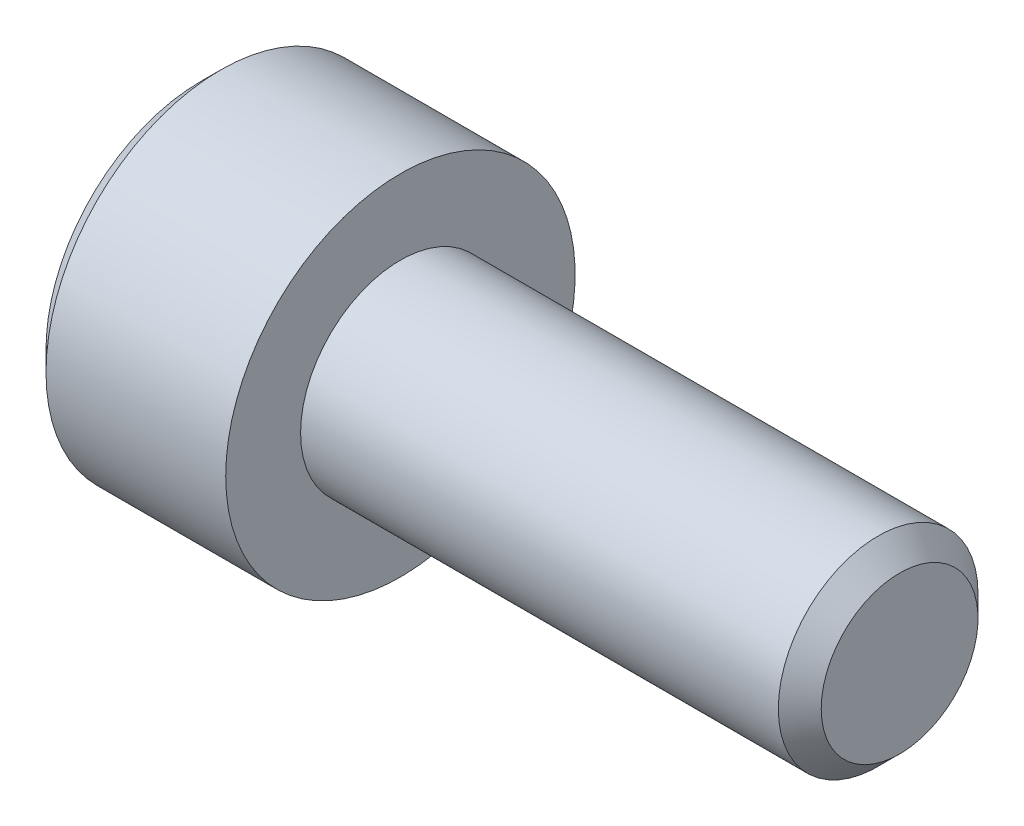
ISO-10303-21;
HEADER;
FILE_DESCRIPTION(('STEP AP214'),'2;1');
FILE_NAME('part.step','',(''),(''),'','','');
FILE_SCHEMA(('AUTOMOTIVE_DESIGN { 1 0 10303 214 1 1 1 1 }'));
ENDSEC;
DATA;
#1=APPLICATION_CONTEXT('core data for automotive mechanical design processes');
#2=APPLICATION_PROTOCOL_DEFINITION('international standard','automotive_design',2000,#1);
#3=PRODUCT_CONTEXT('',#1,'mechanical');
#4=PRODUCT('Part','Part','',(#3));
#5=PRODUCT_RELATED_PRODUCT_CATEGORY('part','',(#4));
#6=PRODUCT_DEFINITION_FORMATION('','',#4);
#7=PRODUCT_DEFINITION_CONTEXT('part definition',#1,'design');
#8=PRODUCT_DEFINITION('design','',#6,#7);
#9=PRODUCT_DEFINITION_SHAPE('','',#8);
#10=(LENGTH_UNIT() NAMED_UNIT(*) SI_UNIT(.MILLI.,.METRE.));
#11=(NAMED_UNIT(*) PLANE_ANGLE_UNIT() SI_UNIT($,.RADIAN.));
#12=(NAMED_UNIT(*) SI_UNIT($,.STERADIAN.) SOLID_ANGLE_UNIT());
#13=UNCERTAINTY_MEASURE_WITH_UNIT(LENGTH_MEASURE(1.E-05),#10,'distance_accuracy_value','');
#14=(GEOMETRIC_REPRESENTATION_CONTEXT(3) GLOBAL_UNCERTAINTY_ASSIGNED_CONTEXT((#13)) GLOBAL_UNIT_ASSIGNED_CONTEXT((#10,
#11,#12)) REPRESENTATION_CONTEXT('',''));
#15=CARTESIAN_POINT('',(0.,0.,0.));
#16=DIRECTION('',(0.,0.,1.));
#17=DIRECTION('',(1.,0.,0.));
#18=AXIS2_PLACEMENT_3D('',#15,#16,#17);
#19=CARTESIAN_POINT('',(-2.,0.,0.));
#20=DIRECTION('',(1.,0.,0.));
#21=DIRECTION('',(0.,0.,-1.));
#22=AXIS2_PLACEMENT_3D('',#19,#20,#21);
#23=PLANE('',#22);
#24=DIRECTION('',(0.,1.,0.));
#25=VECTOR('',#24,1.);
#26=CARTESIAN_POINT('',(-2.,0.866025403784439,1.5));
#27=LINE('',#26,#25);
#28=CARTESIAN_POINT('',(-2.,0.86602540378444,1.5));
#29=VERTEX_POINT('',#28);
#30=CARTESIAN_POINT('',(-1.99999999999056,0.,1.49999999998226));
#31=VERTEX_POINT('',#30);
#32=EDGE_CURVE('E91',#29,#31,#27,.F.);
#33=ORIENTED_EDGE('',*,*,#32,.F.);
#34=DIRECTION('',(0.,0.5,-0.866025403784439));
#35=VECTOR('',#34,1.);
#36=CARTESIAN_POINT('',(-2.,1.73205080756888,0.));
#37=LINE('',#36,#35);
#38=CARTESIAN_POINT('',(-1.99999999999056,1.2990381056613,0.749999999991132));
#39=VERTEX_POINT('',#38);
#40=EDGE_CURVE('E87',#39,#29,#37,.F.);
#41=ORIENTED_EDGE('',*,*,#40,.F.);
#42=CARTESIAN_POINT('',(-1.99999999998113,0.,0.));
#43=DIRECTION('',(-1.,0.,0.));
#44=DIRECTION('',(0.,0.,1.));
#45=AXIS2_PLACEMENT_3D('',#42,#43,#44);
#46=CIRCLE('',#45,1.49999999996453);
#47=EDGE_CURVE('E19',#39,#31,#46,.F.);
#48=ORIENTED_EDGE('',*,*,#47,.T.);
#49=EDGE_LOOP('',(#33,#41,#48));
#50=FACE_BOUND('',#49,.T.);
#51=ADVANCED_FACE('F16',(#50),#23,.F.);
#52=CARTESIAN_POINT('',(-2.,0.,0.));
#53=DIRECTION('',(1.,0.,0.));
#54=DIRECTION('',(0.,0.,-1.));
#55=AXIS2_PLACEMENT_3D('',#52,#53,#54);
#56=PLANE('',#55);
#57=CARTESIAN_POINT('',(-1.99999999998113,0.,0.));
#58=DIRECTION('',(-1.,0.,0.));
#59=DIRECTION('',(0.,0.,1.));
#60=AXIS2_PLACEMENT_3D('',#57,#58,#59);
#61=CIRCLE('',#60,1.49999999996453);
#62=CARTESIAN_POINT('',(-1.99999999999056,1.2990381056613,-0.749999999991131));
#63=VERTEX_POINT('',#62);
#64=EDGE_CURVE('E103',#63,#39,#61,.F.);
#65=ORIENTED_EDGE('',*,*,#64,.T.);
#66=DIRECTION('',(0.,0.5,-0.866025403784439));
#67=VECTOR('',#66,1.);
#68=CARTESIAN_POINT('',(-2.,1.73205080756888,0.));
#69=LINE('',#68,#67);
#70=CARTESIAN_POINT('',(-2.,1.73205080756888,0.));
#71=VERTEX_POINT('',#70);
#72=EDGE_CURVE('E97',#71,#39,#69,.F.);
#73=ORIENTED_EDGE('',*,*,#72,.F.);
#74=DIRECTION('',(0.,-0.5,-0.866025403784439));
#75=VECTOR('',#74,1.);
#76=CARTESIAN_POINT('',(-2.,0.866025403784439,-1.5));
#77=LINE('',#76,#75);
#78=EDGE_CURVE('E113',#63,#71,#77,.F.);
#79=ORIENTED_EDGE('',*,*,#78,.F.);
#80=EDGE_LOOP('',(#65,#73,#79));
#81=FACE_BOUND('',#80,.T.);
#82=ADVANCED_FACE('F110',(#81),#56,.F.);
#83=CARTESIAN_POINT('',(-2.,1.73205080756888,0.));
#84=DIRECTION('',(0.,-0.866025403784439,-0.5));
#85=DIRECTION('',(0.,0.5,-0.866025403784439));
#86=AXIS2_PLACEMENT_3D('',#83,#84,#85);
#87=PLANE('',#86);
#88=ORIENTED_EDGE('',*,*,#40,.T.);
#89=DIRECTION('',(-1.,0.,0.));
#90=VECTOR('',#89,1.);
#91=CARTESIAN_POINT('',(-2.,0.866025403784439,1.5));
#92=LINE('',#91,#90);
#93=CARTESIAN_POINT('',(-4.,0.86602540378444,1.5));
#94=VERTEX_POINT('',#93);
#95=EDGE_CURVE('E131',#94,#29,#92,.F.);
#96=ORIENTED_EDGE('',*,*,#95,.F.);
#97=DIRECTION('',(0.,0.5,-0.866025403784439));
#98=VECTOR('',#97,1.);
#99=CARTESIAN_POINT('',(-4.,1.73205080756888,0.));
#100=LINE('',#99,#98);
#101=CARTESIAN_POINT('',(-4.,1.73205080756888,0.));
#102=VERTEX_POINT('',#101);
#103=EDGE_CURVE('E121',#94,#102,#100,.T.);
#104=ORIENTED_EDGE('',*,*,#103,.T.);
#105=DIRECTION('',(1.,0.,0.));
#106=VECTOR('',#105,1.);
#107=CARTESIAN_POINT('',(-2.,1.73205080756888,0.));
#108=LINE('',#107,#106);
#109=EDGE_CURVE('E120',#71,#102,#108,.F.);
#110=ORIENTED_EDGE('',*,*,#109,.F.);
#111=ORIENTED_EDGE('',*,*,#72,.T.);
#112=EDGE_LOOP('',(#88,#96,#104,#110,#111));
#113=FACE_BOUND('',#112,.T.);
#114=ADVANCED_FACE('F117',(#113),#87,.T.);
#115=CARTESIAN_POINT('',(-2.,0.866025403784439,1.5));
#116=DIRECTION('',(0.,0.,-1.));
#117=DIRECTION('',(-1.,0.,0.));
#118=AXIS2_PLACEMENT_3D('',#115,#116,#117);
#119=PLANE('',#118);
#120=DIRECTION('',(0.,1.,0.));
#121=VECTOR('',#120,1.);
#122=CARTESIAN_POINT('',(-2.,0.,1.5));
#123=LINE('',#122,#121);
#124=CARTESIAN_POINT('',(-2.,-0.866025403784439,1.5));
#125=VERTEX_POINT('',#124);
#126=EDGE_CURVE('E107',#31,#125,#123,.F.);
#127=ORIENTED_EDGE('',*,*,#126,.T.);
#128=DIRECTION('',(1.,0.,0.));
#129=VECTOR('',#128,1.);
#130=CARTESIAN_POINT('',(-2.,-0.866025403784439,1.5));
#131=LINE('',#130,#129);
#132=CARTESIAN_POINT('',(-4.,-0.866025403784439,1.5));
#133=VERTEX_POINT('',#132);
#134=EDGE_CURVE('E176',#133,#125,#131,.T.);
#135=ORIENTED_EDGE('',*,*,#134,.F.);
#136=DIRECTION('',(0.,1.,0.));
#137=VECTOR('',#136,1.);
#138=CARTESIAN_POINT('',(-4.,0.866025403784439,1.5));
#139=LINE('',#138,#137);
#140=EDGE_CURVE('E96',#133,#94,#139,.T.);
#141=ORIENTED_EDGE('',*,*,#140,.T.);
#142=ORIENTED_EDGE('',*,*,#95,.T.);
#143=ORIENTED_EDGE('',*,*,#32,.T.);
#144=EDGE_LOOP('',(#127,#135,#141,#142,#143));
#145=FACE_BOUND('',#144,.T.);
#146=ADVANCED_FACE('F263',(#145),#119,.T.);
#147=CARTESIAN_POINT('',(-2.,0.,0.));
#148=DIRECTION('',(1.,0.,0.));
#149=DIRECTION('',(0.,0.,-1.));
#150=AXIS2_PLACEMENT_3D('',#147,#148,#149);
#151=PLANE('',#150);
#152=DIRECTION('',(0.,0.5,0.866025403784439));
#153=VECTOR('',#152,1.);
#154=CARTESIAN_POINT('',(-2.,-0.866025403784439,1.5));
#155=LINE('',#154,#153);
#156=CARTESIAN_POINT('',(-1.99999999999056,-1.2990381056613,0.749999999991131));
#157=VERTEX_POINT('',#156);
#158=EDGE_CURVE('E167',#125,#157,#155,.F.);
#159=ORIENTED_EDGE('',*,*,#158,.F.);
#160=ORIENTED_EDGE('',*,*,#126,.F.);
#161=CARTESIAN_POINT('',(-1.99999999998113,0.,0.));
#162=DIRECTION('',(-1.,0.,0.));
#163=DIRECTION('',(0.,0.,1.));
#164=AXIS2_PLACEMENT_3D('',#161,#162,#163);
#165=CIRCLE('',#164,1.49999999996453);
#166=EDGE_CURVE('E106',#31,#157,#165,.F.);
#167=ORIENTED_EDGE('',*,*,#166,.T.);
#168=EDGE_LOOP('',(#159,#160,#167));
#169=FACE_BOUND('',#168,.T.);
#170=ADVANCED_FACE('F166',(#169),#151,.F.);
#171=CARTESIAN_POINT('',(-1.99999999998113,0.,0.));
#172=DIRECTION('',(-1.,0.,0.));
#173=DIRECTION('',(0.,0.,1.));
#174=AXIS2_PLACEMENT_3D('',#171,#172,#173);
#175=CONICAL_SURFACE('',#174,1.49999999996453,1.30899693899977);
#176=CARTESIAN_POINT('',(-1.59807621136565,0.,5.6843418860808E-11));
#177=VERTEX_POINT('',#176);
#178=VERTEX_LOOP('',#177);
#179=FACE_BOUND('',#178,.T.);
#180=CARTESIAN_POINT('',(-1.99999999998113,0.,0.));
#181=DIRECTION('',(-1.,0.,0.));
#182=DIRECTION('',(0.,0.,1.));
#183=AXIS2_PLACEMENT_3D('',#180,#181,#182);
#184=CIRCLE('',#183,1.49999999996453);
#185=CARTESIAN_POINT('',(-1.99999999999056,0.,-1.49999999998226));
#186=VERTEX_POINT('',#185);
#187=EDGE_CURVE('E115',#63,#186,#184,.T.);
#188=ORIENTED_EDGE('',*,*,#187,.T.);
#189=CARTESIAN_POINT('',(-1.99999999998113,0.,0.));
#190=DIRECTION('',(-1.,0.,0.));
#191=DIRECTION('',(0.,0.,1.));
#192=AXIS2_PLACEMENT_3D('',#189,#190,#191);
#193=CIRCLE('',#192,1.49999999996453);
#194=CARTESIAN_POINT('',(-1.99999999999056,-1.2990381056613,-0.749999999991133));
#195=VERTEX_POINT('',#194);
#196=EDGE_CURVE('E158',#186,#195,#193,.T.);
#197=ORIENTED_EDGE('',*,*,#196,.T.);
#198=CARTESIAN_POINT('',(-1.99999999998113,0.,0.));
#199=DIRECTION('',(-1.,0.,0.));
#200=DIRECTION('',(0.,0.,1.));
#201=AXIS2_PLACEMENT_3D('',#198,#199,#200);
#202=CIRCLE('',#201,1.49999999996453);
#203=EDGE_CURVE('E160',#195,#157,#202,.T.);
#204=ORIENTED_EDGE('',*,*,#203,.T.);
#205=ORIENTED_EDGE('',*,*,#166,.F.);
#206=ORIENTED_EDGE('',*,*,#47,.F.);
#207=ORIENTED_EDGE('',*,*,#64,.F.);
#208=EDGE_LOOP('',(#188,#197,#204,#205,#206,#207));
#209=FACE_BOUND('',#208,.T.);
#210=ADVANCED_FACE('F102',(#179,#209),#175,.F.);
#211=CARTESIAN_POINT('',(-2.,0.,0.));
#212=DIRECTION('',(1.,0.,0.));
#213=DIRECTION('',(0.,0.,-1.));
#214=AXIS2_PLACEMENT_3D('',#211,#212,#213);
#215=PLANE('',#214);
#216=DIRECTION('',(0.,-0.5,-0.866025403784439));
#217=VECTOR('',#216,1.);
#218=CARTESIAN_POINT('',(-2.,0.866025403784439,-1.5));
#219=LINE('',#218,#217);
#220=CARTESIAN_POINT('',(-2.,0.866025403784438,-1.5));
#221=VERTEX_POINT('',#220);
#222=EDGE_CURVE('E144',#221,#63,#219,.F.);
#223=ORIENTED_EDGE('',*,*,#222,.F.);
#224=DIRECTION('',(0.,1.,0.));
#225=VECTOR('',#224,1.);
#226=CARTESIAN_POINT('',(-2.,-0.866025403784439,-1.5));
#227=LINE('',#226,#225);
#228=EDGE_CURVE('E207',#186,#221,#227,.T.);
#229=ORIENTED_EDGE('',*,*,#228,.F.);
#230=ORIENTED_EDGE('',*,*,#187,.F.);
#231=EDGE_LOOP('',(#223,#229,#230));
#232=FACE_BOUND('',#231,.T.);
#233=ADVANCED_FACE('F238',(#232),#215,.F.);
#234=CARTESIAN_POINT('',(-2.,0.866025403784439,-1.5));
#235=DIRECTION('',(0.,-0.866025403784439,0.5));
#236=DIRECTION('',(0.,-0.5,-0.866025403784439));
#237=AXIS2_PLACEMENT_3D('',#234,#235,#236);
#238=PLANE('',#237);
#239=ORIENTED_EDGE('',*,*,#78,.T.);
#240=ORIENTED_EDGE('',*,*,#109,.T.);
#241=DIRECTION('',(0.,-0.5,-0.866025403784439));
#242=VECTOR('',#241,1.);
#243=CARTESIAN_POINT('',(-4.,0.866025403784439,-1.5));
#244=LINE('',#243,#242);
#245=CARTESIAN_POINT('',(-4.,0.866025403784438,-1.5));
#246=VERTEX_POINT('',#245);
#247=EDGE_CURVE('E141',#102,#246,#244,.T.);
#248=ORIENTED_EDGE('',*,*,#247,.T.);
#249=DIRECTION('',(1.,0.,0.));
#250=VECTOR('',#249,1.);
#251=CARTESIAN_POINT('',(-2.,0.866025403784438,-1.5));
#252=LINE('',#251,#250);
#253=EDGE_CURVE('E195',#221,#246,#252,.F.);
#254=ORIENTED_EDGE('',*,*,#253,.F.);
#255=ORIENTED_EDGE('',*,*,#222,.T.);
#256=EDGE_LOOP('',(#239,#240,#248,#254,#255));
#257=FACE_BOUND('',#256,.T.);
#258=ADVANCED_FACE('F234',(#257),#238,.T.);
#259=CARTESIAN_POINT('',(-2.,-0.866025403784439,1.5));
#260=DIRECTION('',(0.,0.866025403784439,-0.5));
#261=DIRECTION('',(0.,0.5,0.866025403784439));
#262=AXIS2_PLACEMENT_3D('',#259,#260,#261);
#263=PLANE('',#262);
#264=DIRECTION('',(0.,-0.500000000000001,-0.866025403784438));
#265=VECTOR('',#264,1.);
#266=CARTESIAN_POINT('',(-2.,-1.29903810567666,0.75));
#267=LINE('',#266,#265);
#268=CARTESIAN_POINT('',(-2.,-1.73205080756888,0.));
#269=VERTEX_POINT('',#268);
#270=EDGE_CURVE('E162',#157,#269,#267,.T.);
#271=ORIENTED_EDGE('',*,*,#270,.T.);
#272=DIRECTION('',(1.,0.,0.));
#273=VECTOR('',#272,1.);
#274=CARTESIAN_POINT('',(-2.,-1.73205080756888,0.));
#275=LINE('',#274,#273);
#276=CARTESIAN_POINT('',(-4.,-1.73205080756888,0.));
#277=VERTEX_POINT('',#276);
#278=EDGE_CURVE('E193',#277,#269,#275,.T.);
#279=ORIENTED_EDGE('',*,*,#278,.F.);
#280=DIRECTION('',(0.,0.5,0.866025403784439));
#281=VECTOR('',#280,1.);
#282=CARTESIAN_POINT('',(-4.,-0.866025403784439,1.5));
#283=LINE('',#282,#281);
#284=EDGE_CURVE('E198',#277,#133,#283,.T.);
#285=ORIENTED_EDGE('',*,*,#284,.T.);
#286=ORIENTED_EDGE('',*,*,#134,.T.);
#287=ORIENTED_EDGE('',*,*,#158,.T.);
#288=EDGE_LOOP('',(#271,#279,#285,#286,#287));
#289=FACE_BOUND('',#288,.T.);
#290=ADVANCED_FACE('F170',(#289),#263,.T.);
#291=CARTESIAN_POINT('',(-2.,0.,0.));
#292=DIRECTION('',(1.,0.,0.));
#293=DIRECTION('',(0.,0.,-1.));
#294=AXIS2_PLACEMENT_3D('',#291,#292,#293);
#295=PLANE('',#294);
#296=DIRECTION('',(0.,-0.5,0.866025403784439));
#297=VECTOR('',#296,1.);
#298=CARTESIAN_POINT('',(-2.,-1.73205080756888,0.));
#299=LINE('',#298,#297);
#300=EDGE_CURVE('E184',#269,#195,#299,.F.);
#301=ORIENTED_EDGE('',*,*,#300,.F.);
#302=ORIENTED_EDGE('',*,*,#270,.F.);
#303=ORIENTED_EDGE('',*,*,#203,.F.);
#304=EDGE_LOOP('',(#301,#302,#303));
#305=FACE_BOUND('',#304,.T.);
#306=ADVANCED_FACE('F182',(#305),#295,.F.);
#307=CARTESIAN_POINT('',(-2.,0.,0.));
#308=DIRECTION('',(1.,0.,0.));
#309=DIRECTION('',(0.,0.,-1.));
#310=AXIS2_PLACEMENT_3D('',#307,#308,#309);
#311=PLANE('',#310);
#312=DIRECTION('',(0.,1.,0.));
#313=VECTOR('',#312,1.);
#314=CARTESIAN_POINT('',(-2.,-0.866025403784439,-1.5));
#315=LINE('',#314,#313);
#316=CARTESIAN_POINT('',(-2.,-0.866025403784441,-1.5));
#317=VERTEX_POINT('',#316);
#318=EDGE_CURVE('E210',#317,#186,#315,.T.);
#319=ORIENTED_EDGE('',*,*,#318,.F.);
#320=DIRECTION('',(0.,-0.5,0.866025403784439));
#321=VECTOR('',#320,1.);
#322=CARTESIAN_POINT('',(-2.,-1.73205080756888,0.));
#323=LINE('',#322,#321);
#324=EDGE_CURVE('E243',#195,#317,#323,.F.);
#325=ORIENTED_EDGE('',*,*,#324,.F.);
#326=ORIENTED_EDGE('',*,*,#196,.F.);
#327=EDGE_LOOP('',(#319,#325,#326));
#328=FACE_BOUND('',#327,.T.);
#329=ADVANCED_FACE('F241',(#328),#311,.F.);
#330=CARTESIAN_POINT('',(-2.,-0.866025403784439,-1.5));
#331=DIRECTION('',(0.,0.,1.));
#332=DIRECTION('',(1.,0.,0.));
#333=AXIS2_PLACEMENT_3D('',#330,#331,#332);
#334=PLANE('',#333);
#335=ORIENTED_EDGE('',*,*,#228,.T.);
#336=ORIENTED_EDGE('',*,*,#253,.T.);
#337=DIRECTION('',(0.,1.,0.));
#338=VECTOR('',#337,1.);
#339=CARTESIAN_POINT('',(-4.,-0.866025403784439,-1.5));
#340=LINE('',#339,#338);
#341=CARTESIAN_POINT('',(-4.,-0.86602540378444,-1.5));
#342=VERTEX_POINT('',#341);
#343=EDGE_CURVE('E34',#246,#342,#340,.F.);
#344=ORIENTED_EDGE('',*,*,#343,.T.);
#345=DIRECTION('',(1.,0.,0.));
#346=VECTOR('',#345,1.);
#347=CARTESIAN_POINT('',(-2.,-0.866025403784441,-1.5));
#348=LINE('',#347,#346);
#349=EDGE_CURVE('E204',#317,#342,#348,.F.);
#350=ORIENTED_EDGE('',*,*,#349,.F.);
#351=ORIENTED_EDGE('',*,*,#318,.T.);
#352=EDGE_LOOP('',(#335,#336,#344,#350,#351));
#353=FACE_BOUND('',#352,.T.);
#354=ADVANCED_FACE('F257',(#353),#334,.T.);
#355=CARTESIAN_POINT('',(-2.,-1.73205080756888,0.));
#356=DIRECTION('',(0.,0.866025403784439,0.5));
#357=DIRECTION('',(0.,-0.5,0.866025403784439));
#358=AXIS2_PLACEMENT_3D('',#355,#356,#357);
#359=PLANE('',#358);
#360=ORIENTED_EDGE('',*,*,#324,.T.);
#361=ORIENTED_EDGE('',*,*,#349,.T.);
#362=DIRECTION('',(0.,-0.500000000000001,0.866025403784438));
#363=VECTOR('',#362,1.);
#364=CARTESIAN_POINT('',(-4.,-0.866025403784439,-1.5));
#365=LINE('',#364,#363);
#366=EDGE_CURVE('E157',#342,#277,#365,.T.);
#367=ORIENTED_EDGE('',*,*,#366,.T.);
#368=ORIENTED_EDGE('',*,*,#278,.T.);
#369=ORIENTED_EDGE('',*,*,#300,.T.);
#370=EDGE_LOOP('',(#360,#361,#367,#368,#369));
#371=FACE_BOUND('',#370,.T.);
#372=ADVANCED_FACE('F246',(#371),#359,.T.);
#373=CARTESIAN_POINT('',(-4.,0.,0.));
#374=DIRECTION('',(1.,0.,0.));
#375=DIRECTION('',(0.,0.,-1.));
#376=AXIS2_PLACEMENT_3D('',#373,#374,#375);
#377=PLANE('',#376);
#378=ORIENTED_EDGE('',*,*,#343,.F.);
#379=ORIENTED_EDGE('',*,*,#247,.F.);
#380=ORIENTED_EDGE('',*,*,#103,.F.);
#381=ORIENTED_EDGE('',*,*,#140,.F.);
#382=ORIENTED_EDGE('',*,*,#284,.F.);
#383=ORIENTED_EDGE('',*,*,#366,.F.);
#384=EDGE_LOOP('',(#378,#379,#380,#381,#382,#383));
#385=FACE_BOUND('',#384,.T.);
#386=CARTESIAN_POINT('',(-4.0000000000191,0.,0.));
#387=DIRECTION('',(1.,0.,0.));
#388=DIRECTION('',(0.,1.,0.));
#389=AXIS2_PLACEMENT_3D('',#386,#387,#388);
#390=CIRCLE('',#389,3.0999999999608);
#391=CARTESIAN_POINT('',(-4.0000000000191,3.0999999999608,0.));
#392=VERTEX_POINT('',#391);
#393=EDGE_CURVE('E154',#392,#392,#390,.T.);
#394=ORIENTED_EDGE('',*,*,#393,.F.);
#395=EDGE_LOOP('',(#394));
#396=FACE_BOUND('',#395,.T.);
#397=ADVANCED_FACE('F260',(#385,#396),#377,.F.);
#398=CARTESIAN_POINT('',(-3.60000000006266,0.,0.));
#399=DIRECTION('',(1.,0.,0.));
#400=DIRECTION('',(0.,1.,0.));
#401=AXIS2_PLACEMENT_3D('',#398,#399,#400);
#402=CONICAL_SURFACE('',#401,3.49999999997408,0.785398163468503);
#403=ORIENTED_EDGE('',*,*,#393,.T.);
#404=EDGE_LOOP('',(#403));
#405=FACE_BOUND('',#404,.T.);
#406=CARTESIAN_POINT('',(-3.6,0.,0.));
#407=DIRECTION('',(-1.,0.,0.));
#408=DIRECTION('',(0.,0.,1.));
#409=AXIS2_PLACEMENT_3D('',#406,#407,#408);
#410=CIRCLE('',#409,3.5);
#411=CARTESIAN_POINT('',(-3.6,0.,3.5));
#412=VERTEX_POINT('',#411);
#413=EDGE_CURVE('E153',#412,#412,#410,.F.);
#414=ORIENTED_EDGE('',*,*,#413,.F.);
#415=EDGE_LOOP('',(#414));
#416=FACE_BOUND('',#415,.T.);
#417=ADVANCED_FACE('F296',(#405,#416),#402,.T.);
#418=CARTESIAN_POINT('',(10.,1.5705,0.));
#419=DIRECTION('',(-1.,0.,0.));
#420=DIRECTION('',(0.,0.,1.));
#421=AXIS2_PLACEMENT_3D('',#418,#419,#420);
#422=PLANE('',#421);
#423=CARTESIAN_POINT('',(9.99999999999091,0.,0.));
#424=DIRECTION('',(-1.,0.,0.));
#425=DIRECTION('',(0.,0.,1.));
#426=AXIS2_PLACEMENT_3D('',#423,#424,#425);
#427=CIRCLE('',#426,1.57050000001391);
#428=CARTESIAN_POINT('',(9.99999999999091,0.,1.57050000001391));
#429=VERTEX_POINT('',#428);
#430=EDGE_CURVE('E150',#429,#429,#427,.T.);
#431=ORIENTED_EDGE('',*,*,#430,.F.);
#432=EDGE_LOOP('',(#431));
#433=FACE_BOUND('',#432,.T.);
#434=ADVANCED_FACE('F292',(#433),#422,.F.);
#435=CARTESIAN_POINT('',(10.,0.,0.));
#436=DIRECTION('',(-1.,0.,0.));
#437=DIRECTION('',(0.,0.,1.));
#438=AXIS2_PLACEMENT_3D('',#435,#436,#437);
#439=CYLINDRICAL_SURFACE('',#438,3.5);
#440=ORIENTED_EDGE('',*,*,#413,.T.);
#441=EDGE_LOOP('',(#440));
#442=FACE_BOUND('',#441,.T.);
#443=CARTESIAN_POINT('',(0.,0.,0.));
#444=DIRECTION('',(-1.,0.,0.));
#445=DIRECTION('',(0.,0.,1.));
#446=AXIS2_PLACEMENT_3D('',#443,#444,#445);
#447=CIRCLE('',#446,3.5);
#448=CARTESIAN_POINT('',(0.,0.,3.5));
#449=VERTEX_POINT('',#448);
#450=EDGE_CURVE('E147',#449,#449,#447,.T.);
#451=ORIENTED_EDGE('',*,*,#450,.T.);
#452=EDGE_LOOP('',(#451));
#453=FACE_BOUND('',#452,.T.);
#454=ADVANCED_FACE('F288',(#442,#453),#439,.T.);
#455=CARTESIAN_POINT('',(9.57049999993842,0.,0.));
#456=DIRECTION('',(-1.,0.,0.));
#457=DIRECTION('',(0.,0.,1.));
#458=AXIS2_PLACEMENT_3D('',#455,#456,#457);
#459=CONICAL_SURFACE('',#458,2.00000000000955,0.785398163331274);
#460=CARTESIAN_POINT('',(9.5705,0.,0.));
#461=DIRECTION('',(-1.,0.,0.));
#462=DIRECTION('',(0.,0.,1.));
#463=AXIS2_PLACEMENT_3D('',#460,#461,#462);
#464=CIRCLE('',#463,2.);
#465=CARTESIAN_POINT('',(9.5705,0.,2.));
#466=VERTEX_POINT('',#465);
#467=EDGE_CURVE('E25',#466,#466,#464,.T.);
#468=ORIENTED_EDGE('',*,*,#467,.F.);
#469=EDGE_LOOP('',(#468));
#470=FACE_BOUND('',#469,.T.);
#471=ORIENTED_EDGE('',*,*,#430,.T.);
#472=EDGE_LOOP('',(#471));
#473=FACE_BOUND('',#472,.T.);
#474=ADVANCED_FACE('F281',(#470,#473),#459,.T.);
#475=CARTESIAN_POINT('',(0.,3.5,0.));
#476=DIRECTION('',(-1.,0.,0.));
#477=DIRECTION('',(0.,0.,1.));
#478=AXIS2_PLACEMENT_3D('',#475,#476,#477);
#479=PLANE('',#478);
#480=ORIENTED_EDGE('',*,*,#450,.F.);
#481=EDGE_LOOP('',(#480));
#482=FACE_BOUND('',#481,.T.);
#483=CARTESIAN_POINT('',(0.,0.,0.));
#484=DIRECTION('',(-1.,0.,0.));
#485=DIRECTION('',(0.,0.,1.));
#486=AXIS2_PLACEMENT_3D('',#483,#484,#485);
#487=CIRCLE('',#486,2.);
#488=CARTESIAN_POINT('',(0.,0.,2.));
#489=VERTEX_POINT('',#488);
#490=EDGE_CURVE('E11',#489,#489,#487,.F.);
#491=ORIENTED_EDGE('',*,*,#490,.F.);
#492=EDGE_LOOP('',(#491));
#493=FACE_BOUND('',#492,.T.);
#494=ADVANCED_FACE('F275',(#482,#493),#479,.F.);
#495=CARTESIAN_POINT('',(10.,0.,0.));
#496=DIRECTION('',(-1.,0.,0.));
#497=DIRECTION('',(0.,0.,1.));
#498=AXIS2_PLACEMENT_3D('',#495,#496,#497);
#499=CYLINDRICAL_SURFACE('',#498,2.);
#500=ORIENTED_EDGE('',*,*,#490,.T.);
#501=EDGE_LOOP('',(#500));
#502=FACE_BOUND('',#501,.T.);
#503=ORIENTED_EDGE('',*,*,#467,.T.);
#504=EDGE_LOOP('',(#503));
#505=FACE_BOUND('',#504,.T.);
#506=ADVANCED_FACE('F273',(#502,#505),#499,.T.);
#507=CLOSED_SHELL('',(#51,#82,#114,#146,#170,#210,#233,#258,#290,#306,#329,#354,#372,#397,#417,
#434,#454,#474,#494,#506));
#508=MANIFOLD_SOLID_BREP('B1',#507);
#509=ADVANCED_BREP_SHAPE_REPRESENTATION('',(#18,#508),#14);
#510=SHAPE_DEFINITION_REPRESENTATION(#9,#509);
ENDSEC;
END-ISO-10303-21;
